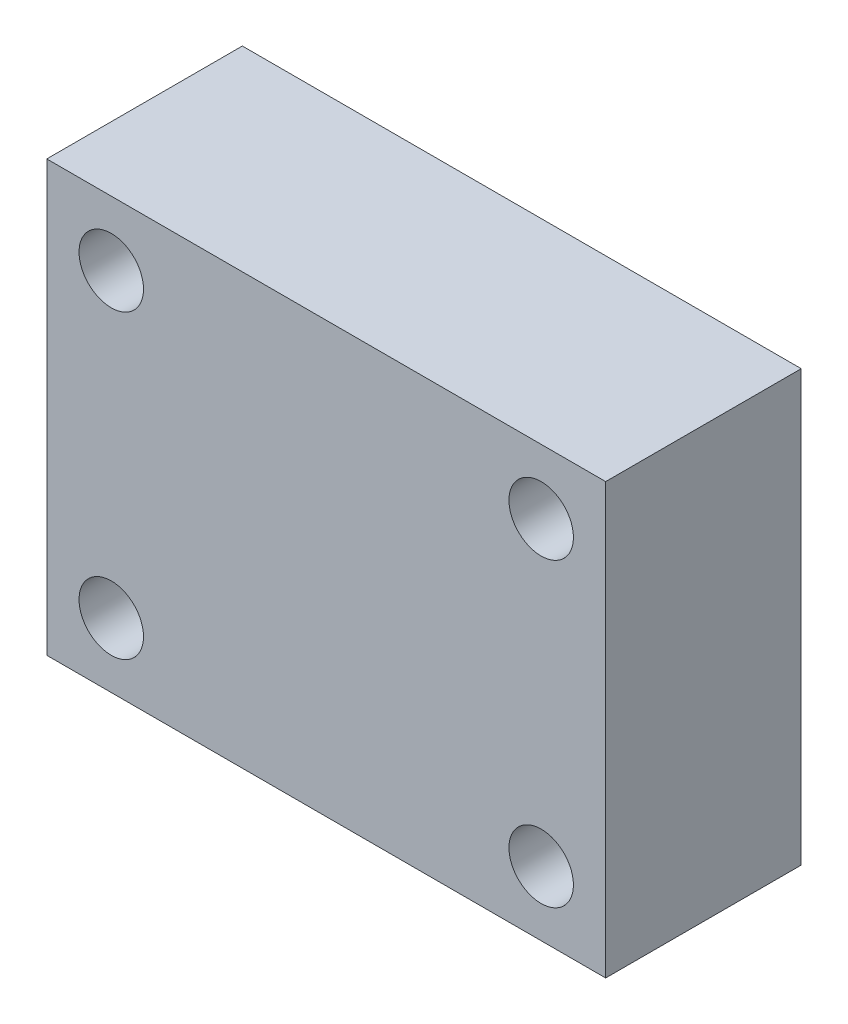
ISO-10303-21;
HEADER;
FILE_DESCRIPTION(('STEP AP214'),'2;1');
FILE_NAME('part.step','',(''),(''),'','','');
FILE_SCHEMA(('AUTOMOTIVE_DESIGN { 1 0 10303 214 1 1 1 1 }'));
ENDSEC;
DATA;
#1=APPLICATION_CONTEXT('core data for automotive mechanical design processes');
#2=APPLICATION_PROTOCOL_DEFINITION('international standard','automotive_design',2000,#1);
#3=PRODUCT_CONTEXT('',#1,'mechanical');
#4=PRODUCT('Part','Part','',(#3));
#5=PRODUCT_RELATED_PRODUCT_CATEGORY('part','',(#4));
#6=PRODUCT_DEFINITION_FORMATION('','',#4);
#7=PRODUCT_DEFINITION_CONTEXT('part definition',#1,'design');
#8=PRODUCT_DEFINITION('design','',#6,#7);
#9=PRODUCT_DEFINITION_SHAPE('','',#8);
#10=(LENGTH_UNIT() NAMED_UNIT(*) SI_UNIT(.MILLI.,.METRE.));
#11=(NAMED_UNIT(*) PLANE_ANGLE_UNIT() SI_UNIT($,.RADIAN.));
#12=(NAMED_UNIT(*) SI_UNIT($,.STERADIAN.) SOLID_ANGLE_UNIT());
#13=UNCERTAINTY_MEASURE_WITH_UNIT(LENGTH_MEASURE(1.E-05),#10,'distance_accuracy_value','');
#14=(GEOMETRIC_REPRESENTATION_CONTEXT(3) GLOBAL_UNCERTAINTY_ASSIGNED_CONTEXT((#13)) GLOBAL_UNIT_ASSIGNED_CONTEXT((#10,
#11,#12)) REPRESENTATION_CONTEXT('',''));
#15=CARTESIAN_POINT('',(0.,0.,0.));
#16=DIRECTION('',(0.,0.,1.));
#17=DIRECTION('',(1.,0.,0.));
#18=AXIS2_PLACEMENT_3D('',#15,#16,#17);
#19=CARTESIAN_POINT('',(0.,0.,18.19490677));
#20=DIRECTION('',(0.,0.,1.));
#21=DIRECTION('',(1.,0.,0.));
#22=AXIS2_PLACEMENT_3D('',#19,#20,#21);
#23=PLANE('',#22);
#24=CARTESIAN_POINT('',(6.,-34.,18.19490677));
#25=DIRECTION('',(0.,0.,1.));
#26=DIRECTION('',(1.,0.,0.));
#27=AXIS2_PLACEMENT_3D('',#24,#25,#26);
#28=CIRCLE('',#27,3.);
#29=CARTESIAN_POINT('',(9.00000000000001,-34.,18.19490677));
#30=VERTEX_POINT('',#29);
#31=EDGE_CURVE('E142',#30,#30,#28,.T.);
#32=ORIENTED_EDGE('',*,*,#31,.F.);
#33=EDGE_LOOP('',(#32));
#34=FACE_BOUND('',#33,.T.);
#35=CARTESIAN_POINT('',(6.,-6.,18.19490677));
#36=DIRECTION('',(0.,0.,1.));
#37=DIRECTION('',(1.,0.,0.));
#38=AXIS2_PLACEMENT_3D('',#35,#36,#37);
#39=CIRCLE('',#38,3.);
#40=CARTESIAN_POINT('',(9.,-6.,18.19490677));
#41=VERTEX_POINT('',#40);
#42=EDGE_CURVE('E112',#41,#41,#39,.T.);
#43=ORIENTED_EDGE('',*,*,#42,.F.);
#44=EDGE_LOOP('',(#43));
#45=FACE_BOUND('',#44,.T.);
#46=DIRECTION('',(0.,-1.,0.));
#47=VECTOR('',#46,1.);
#48=CARTESIAN_POINT('',(0.,0.,18.19490677));
#49=LINE('',#48,#47);
#50=CARTESIAN_POINT('',(0.,0.,18.19490677));
#51=VERTEX_POINT('',#50);
#52=CARTESIAN_POINT('',(0.,-40.,18.19490677));
#53=VERTEX_POINT('',#52);
#54=EDGE_CURVE('E92',#51,#53,#49,.T.);
#55=ORIENTED_EDGE('',*,*,#54,.T.);
#56=DIRECTION('',(1.,0.,0.));
#57=VECTOR('',#56,1.);
#58=CARTESIAN_POINT('',(0.,-40.,18.19490677));
#59=LINE('',#58,#57);
#60=CARTESIAN_POINT('',(52.,-40.,18.19490677));
#61=VERTEX_POINT('',#60);
#62=EDGE_CURVE('E87',#53,#61,#59,.T.);
#63=ORIENTED_EDGE('',*,*,#62,.T.);
#64=DIRECTION('',(0.,1.,0.));
#65=VECTOR('',#64,1.);
#66=CARTESIAN_POINT('',(52.,0.,18.19490677));
#67=LINE('',#66,#65);
#68=CARTESIAN_POINT('',(52.,0.,18.19490677));
#69=VERTEX_POINT('',#68);
#70=EDGE_CURVE('E90',#61,#69,#67,.T.);
#71=ORIENTED_EDGE('',*,*,#70,.T.);
#72=DIRECTION('',(-1.,0.,0.));
#73=VECTOR('',#72,1.);
#74=CARTESIAN_POINT('',(0.,0.,18.19490677));
#75=LINE('',#74,#73);
#76=EDGE_CURVE('E57',#69,#51,#75,.T.);
#77=ORIENTED_EDGE('',*,*,#76,.T.);
#78=EDGE_LOOP('',(#55,#63,#71,#77));
#79=FACE_BOUND('',#78,.T.);
#80=CARTESIAN_POINT('',(46.,-6.,18.19490677));
#81=DIRECTION('',(0.,0.,1.));
#82=DIRECTION('',(1.,0.,0.));
#83=AXIS2_PLACEMENT_3D('',#80,#81,#82);
#84=CIRCLE('',#83,3.);
#85=CARTESIAN_POINT('',(49.,-6.,18.19490677));
#86=VERTEX_POINT('',#85);
#87=EDGE_CURVE('E134',#86,#86,#84,.T.);
#88=ORIENTED_EDGE('',*,*,#87,.F.);
#89=EDGE_LOOP('',(#88));
#90=FACE_BOUND('',#89,.T.);
#91=CARTESIAN_POINT('',(46.,-34.,18.19490677));
#92=DIRECTION('',(0.,0.,1.));
#93=DIRECTION('',(1.,0.,0.));
#94=AXIS2_PLACEMENT_3D('',#91,#92,#93);
#95=CIRCLE('',#94,3.);
#96=CARTESIAN_POINT('',(49.,-34.,18.19490677));
#97=VERTEX_POINT('',#96);
#98=EDGE_CURVE('E150',#97,#97,#95,.T.);
#99=ORIENTED_EDGE('',*,*,#98,.F.);
#100=EDGE_LOOP('',(#99));
#101=FACE_BOUND('',#100,.T.);
#102=ADVANCED_FACE('F39',(#34,#45,#79,#90,#101),#23,.T.);
#103=CARTESIAN_POINT('',(0.,0.,0.));
#104=DIRECTION('',(0.,0.,1.));
#105=DIRECTION('',(1.,0.,0.));
#106=AXIS2_PLACEMENT_3D('',#103,#104,#105);
#107=PLANE('',#106);
#108=DIRECTION('',(0.,-1.,0.));
#109=VECTOR('',#108,1.);
#110=CARTESIAN_POINT('',(0.,0.,0.));
#111=LINE('',#110,#109);
#112=CARTESIAN_POINT('',(0.,0.,0.));
#113=VERTEX_POINT('',#112);
#114=CARTESIAN_POINT('',(0.,-40.,0.));
#115=VERTEX_POINT('',#114);
#116=EDGE_CURVE('E108',#113,#115,#111,.T.);
#117=ORIENTED_EDGE('',*,*,#116,.F.);
#118=DIRECTION('',(-1.,0.,0.));
#119=VECTOR('',#118,1.);
#120=CARTESIAN_POINT('',(0.,0.,0.));
#121=LINE('',#120,#119);
#122=CARTESIAN_POINT('',(52.,0.,0.));
#123=VERTEX_POINT('',#122);
#124=EDGE_CURVE('E80',#123,#113,#121,.T.);
#125=ORIENTED_EDGE('',*,*,#124,.F.);
#126=DIRECTION('',(0.,1.,0.));
#127=VECTOR('',#126,1.);
#128=CARTESIAN_POINT('',(52.,0.,0.));
#129=LINE('',#128,#127);
#130=CARTESIAN_POINT('',(52.,-40.,0.));
#131=VERTEX_POINT('',#130);
#132=EDGE_CURVE('E74',#131,#123,#129,.T.);
#133=ORIENTED_EDGE('',*,*,#132,.F.);
#134=DIRECTION('',(1.,0.,0.));
#135=VECTOR('',#134,1.);
#136=CARTESIAN_POINT('',(0.,-40.,0.));
#137=LINE('',#136,#135);
#138=EDGE_CURVE('E97',#115,#131,#137,.T.);
#139=ORIENTED_EDGE('',*,*,#138,.F.);
#140=EDGE_LOOP('',(#117,#125,#133,#139));
#141=FACE_BOUND('',#140,.T.);
#142=CARTESIAN_POINT('',(6.,-6.,0.));
#143=DIRECTION('',(0.,0.,1.));
#144=DIRECTION('',(1.,0.,0.));
#145=AXIS2_PLACEMENT_3D('',#142,#143,#144);
#146=CIRCLE('',#145,3.);
#147=CARTESIAN_POINT('',(9.,-6.,0.));
#148=VERTEX_POINT('',#147);
#149=EDGE_CURVE('E130',#148,#148,#146,.T.);
#150=ORIENTED_EDGE('',*,*,#149,.T.);
#151=EDGE_LOOP('',(#150));
#152=FACE_BOUND('',#151,.T.);
#153=CARTESIAN_POINT('',(46.,-6.,0.));
#154=DIRECTION('',(0.,0.,1.));
#155=DIRECTION('',(1.,0.,0.));
#156=AXIS2_PLACEMENT_3D('',#153,#154,#155);
#157=CIRCLE('',#156,3.);
#158=CARTESIAN_POINT('',(49.,-6.,0.));
#159=VERTEX_POINT('',#158);
#160=EDGE_CURVE('E138',#159,#159,#157,.T.);
#161=ORIENTED_EDGE('',*,*,#160,.T.);
#162=EDGE_LOOP('',(#161));
#163=FACE_BOUND('',#162,.T.);
#164=CARTESIAN_POINT('',(6.,-34.,0.));
#165=DIRECTION('',(0.,0.,1.));
#166=DIRECTION('',(1.,0.,0.));
#167=AXIS2_PLACEMENT_3D('',#164,#165,#166);
#168=CIRCLE('',#167,3.);
#169=CARTESIAN_POINT('',(9.00000000000001,-34.,0.));
#170=VERTEX_POINT('',#169);
#171=EDGE_CURVE('E146',#170,#170,#168,.T.);
#172=ORIENTED_EDGE('',*,*,#171,.T.);
#173=EDGE_LOOP('',(#172));
#174=FACE_BOUND('',#173,.T.);
#175=CARTESIAN_POINT('',(46.,-34.,0.));
#176=DIRECTION('',(0.,0.,1.));
#177=DIRECTION('',(1.,0.,0.));
#178=AXIS2_PLACEMENT_3D('',#175,#176,#177);
#179=CIRCLE('',#178,3.);
#180=CARTESIAN_POINT('',(49.,-34.,0.));
#181=VERTEX_POINT('',#180);
#182=EDGE_CURVE('E154',#181,#181,#179,.T.);
#183=ORIENTED_EDGE('',*,*,#182,.T.);
#184=EDGE_LOOP('',(#183));
#185=FACE_BOUND('',#184,.T.);
#186=ADVANCED_FACE('F125',(#141,#152,#163,#174,#185),#107,.F.);
#187=CARTESIAN_POINT('',(0.,0.,18.19490677));
#188=DIRECTION('',(1.,0.,0.));
#189=DIRECTION('',(0.,1.,0.));
#190=AXIS2_PLACEMENT_3D('',#187,#188,#189);
#191=PLANE('',#190);
#192=ORIENTED_EDGE('',*,*,#116,.T.);
#193=DIRECTION('',(0.,0.,-1.));
#194=VECTOR('',#193,1.);
#195=CARTESIAN_POINT('',(0.,-40.,18.19490677));
#196=LINE('',#195,#194);
#197=EDGE_CURVE('E11',#53,#115,#196,.T.);
#198=ORIENTED_EDGE('',*,*,#197,.F.);
#199=ORIENTED_EDGE('',*,*,#54,.F.);
#200=DIRECTION('',(0.,0.,-1.));
#201=VECTOR('',#200,1.);
#202=CARTESIAN_POINT('',(0.,0.,18.19490677));
#203=LINE('',#202,#201);
#204=EDGE_CURVE('E104',#51,#113,#203,.T.);
#205=ORIENTED_EDGE('',*,*,#204,.T.);
#206=EDGE_LOOP('',(#192,#198,#199,#205));
#207=FACE_BOUND('',#206,.T.);
#208=ADVANCED_FACE('F41',(#207),#191,.F.);
#209=CARTESIAN_POINT('',(0.,-40.,18.19490677));
#210=DIRECTION('',(0.,1.,0.));
#211=DIRECTION('',(0.,0.,1.));
#212=AXIS2_PLACEMENT_3D('',#209,#210,#211);
#213=PLANE('',#212);
#214=ORIENTED_EDGE('',*,*,#138,.T.);
#215=DIRECTION('',(0.,0.,-1.));
#216=VECTOR('',#215,1.);
#217=CARTESIAN_POINT('',(52.,-40.,18.19490677));
#218=LINE('',#217,#216);
#219=EDGE_CURVE('E49',#61,#131,#218,.T.);
#220=ORIENTED_EDGE('',*,*,#219,.F.);
#221=ORIENTED_EDGE('',*,*,#62,.F.);
#222=ORIENTED_EDGE('',*,*,#197,.T.);
#223=EDGE_LOOP('',(#214,#220,#221,#222));
#224=FACE_BOUND('',#223,.T.);
#225=ADVANCED_FACE('F96',(#224),#213,.F.);
#226=CARTESIAN_POINT('',(52.,0.,18.19490677));
#227=DIRECTION('',(-1.,0.,0.));
#228=DIRECTION('',(0.,-1.,0.));
#229=AXIS2_PLACEMENT_3D('',#226,#227,#228);
#230=PLANE('',#229);
#231=ORIENTED_EDGE('',*,*,#132,.T.);
#232=DIRECTION('',(0.,0.,-1.));
#233=VECTOR('',#232,1.);
#234=CARTESIAN_POINT('',(52.,0.,18.19490677));
#235=LINE('',#234,#233);
#236=EDGE_CURVE('E99',#69,#123,#235,.T.);
#237=ORIENTED_EDGE('',*,*,#236,.F.);
#238=ORIENTED_EDGE('',*,*,#70,.F.);
#239=ORIENTED_EDGE('',*,*,#219,.T.);
#240=EDGE_LOOP('',(#231,#237,#238,#239));
#241=FACE_BOUND('',#240,.T.);
#242=ADVANCED_FACE('F100',(#241),#230,.F.);
#243=CARTESIAN_POINT('',(0.,0.,18.19490677));
#244=DIRECTION('',(0.,-1.,0.));
#245=DIRECTION('',(0.,0.,-1.));
#246=AXIS2_PLACEMENT_3D('',#243,#244,#245);
#247=PLANE('',#246);
#248=ORIENTED_EDGE('',*,*,#124,.T.);
#249=ORIENTED_EDGE('',*,*,#204,.F.);
#250=ORIENTED_EDGE('',*,*,#76,.F.);
#251=ORIENTED_EDGE('',*,*,#236,.T.);
#252=EDGE_LOOP('',(#248,#249,#250,#251));
#253=FACE_BOUND('',#252,.T.);
#254=ADVANCED_FACE('F122',(#253),#247,.F.);
#255=CARTESIAN_POINT('',(6.,-6.,18.19490677));
#256=DIRECTION('',(0.,0.,-1.));
#257=DIRECTION('',(-1.,0.,0.));
#258=AXIS2_PLACEMENT_3D('',#255,#256,#257);
#259=CYLINDRICAL_SURFACE('',#258,3.);
#260=ORIENTED_EDGE('',*,*,#42,.T.);
#261=EDGE_LOOP('',(#260));
#262=FACE_BOUND('',#261,.T.);
#263=ORIENTED_EDGE('',*,*,#149,.F.);
#264=EDGE_LOOP('',(#263));
#265=FACE_BOUND('',#264,.T.);
#266=ADVANCED_FACE('F175',(#262,#265),#259,.F.);
#267=CARTESIAN_POINT('',(46.,-6.,18.19490677));
#268=DIRECTION('',(0.,0.,-1.));
#269=DIRECTION('',(-1.,0.,0.));
#270=AXIS2_PLACEMENT_3D('',#267,#268,#269);
#271=CYLINDRICAL_SURFACE('',#270,3.);
#272=ORIENTED_EDGE('',*,*,#87,.T.);
#273=EDGE_LOOP('',(#272));
#274=FACE_BOUND('',#273,.T.);
#275=ORIENTED_EDGE('',*,*,#160,.F.);
#276=EDGE_LOOP('',(#275));
#277=FACE_BOUND('',#276,.T.);
#278=ADVANCED_FACE('F221',(#274,#277),#271,.F.);
#279=CARTESIAN_POINT('',(6.,-34.,18.19490677));
#280=DIRECTION('',(0.,0.,-1.));
#281=DIRECTION('',(-1.,0.,0.));
#282=AXIS2_PLACEMENT_3D('',#279,#280,#281);
#283=CYLINDRICAL_SURFACE('',#282,3.);
#284=ORIENTED_EDGE('',*,*,#31,.T.);
#285=EDGE_LOOP('',(#284));
#286=FACE_BOUND('',#285,.T.);
#287=ORIENTED_EDGE('',*,*,#171,.F.);
#288=EDGE_LOOP('',(#287));
#289=FACE_BOUND('',#288,.T.);
#290=ADVANCED_FACE('F229',(#286,#289),#283,.F.);
#291=CARTESIAN_POINT('',(46.,-34.,18.19490677));
#292=DIRECTION('',(0.,0.,-1.));
#293=DIRECTION('',(-1.,0.,0.));
#294=AXIS2_PLACEMENT_3D('',#291,#292,#293);
#295=CYLINDRICAL_SURFACE('',#294,3.);
#296=ORIENTED_EDGE('',*,*,#98,.T.);
#297=EDGE_LOOP('',(#296));
#298=FACE_BOUND('',#297,.T.);
#299=ORIENTED_EDGE('',*,*,#182,.F.);
#300=EDGE_LOOP('',(#299));
#301=FACE_BOUND('',#300,.T.);
#302=ADVANCED_FACE('F162',(#298,#301),#295,.F.);
#303=CLOSED_SHELL('',(#102,#186,#208,#225,#242,#254,#266,#278,#290,#302));
#304=MANIFOLD_SOLID_BREP('B2',#303);
#305=ADVANCED_BREP_SHAPE_REPRESENTATION('',(#18,#304),#14);
#306=SHAPE_DEFINITION_REPRESENTATION(#9,#305);
ENDSEC;
END-ISO-10303-21;
